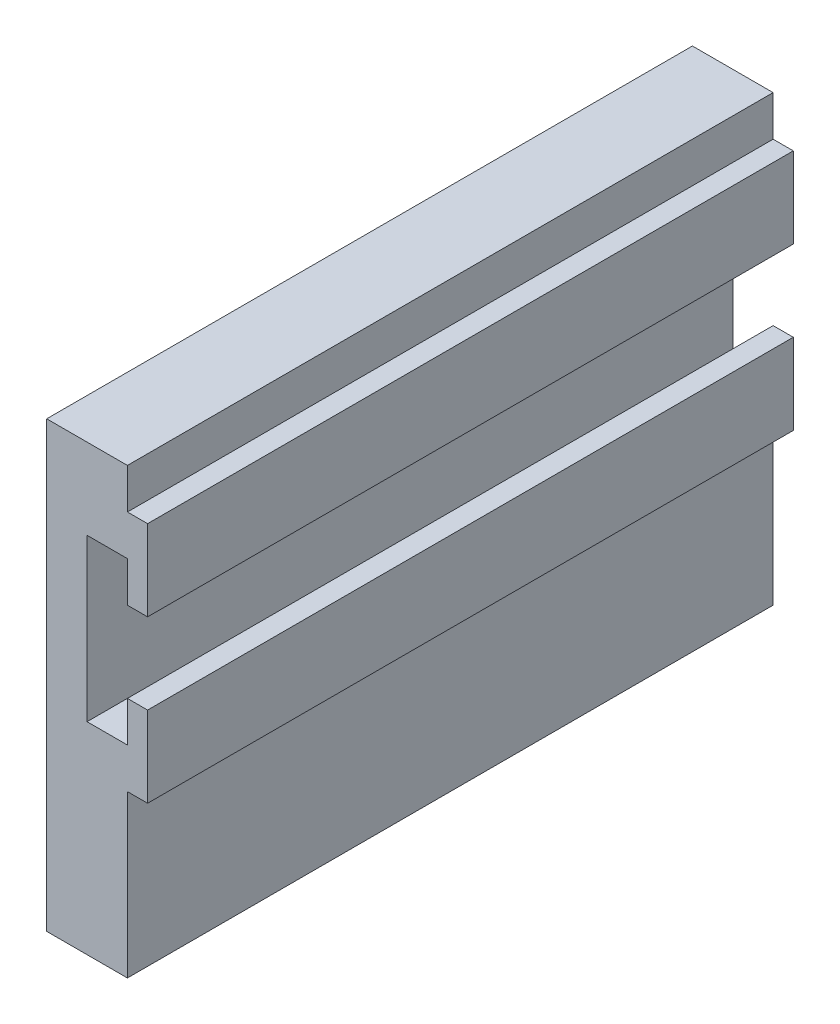
ISO-10303-21;
HEADER;
FILE_DESCRIPTION(('STEP AP214'),'2;1');
FILE_NAME('part.step','',(''),(''),'','','');
FILE_SCHEMA(('AUTOMOTIVE_DESIGN { 1 0 10303 214 1 1 1 1 }'));
ENDSEC;
DATA;
#1=APPLICATION_CONTEXT('core data for automotive mechanical design processes');
#2=APPLICATION_PROTOCOL_DEFINITION('international standard','automotive_design',2000,#1);
#3=PRODUCT_CONTEXT('',#1,'mechanical');
#4=PRODUCT('Part','Part','',(#3));
#5=PRODUCT_RELATED_PRODUCT_CATEGORY('part','',(#4));
#6=PRODUCT_DEFINITION_FORMATION('','',#4);
#7=PRODUCT_DEFINITION_CONTEXT('part definition',#1,'design');
#8=PRODUCT_DEFINITION('design','',#6,#7);
#9=PRODUCT_DEFINITION_SHAPE('','',#8);
#10=(LENGTH_UNIT() NAMED_UNIT(*) SI_UNIT(.MILLI.,.METRE.));
#11=(NAMED_UNIT(*) PLANE_ANGLE_UNIT() SI_UNIT($,.RADIAN.));
#12=(NAMED_UNIT(*) SI_UNIT($,.STERADIAN.) SOLID_ANGLE_UNIT());
#13=UNCERTAINTY_MEASURE_WITH_UNIT(LENGTH_MEASURE(1.E-05),#10,'distance_accuracy_value','');
#14=(GEOMETRIC_REPRESENTATION_CONTEXT(3) GLOBAL_UNCERTAINTY_ASSIGNED_CONTEXT((#13)) GLOBAL_UNIT_ASSIGNED_CONTEXT((#10,
#11,#12)) REPRESENTATION_CONTEXT('',''));
#15=CARTESIAN_POINT('',(0.,0.,0.));
#16=DIRECTION('',(0.,0.,1.));
#17=DIRECTION('',(1.,0.,0.));
#18=AXIS2_PLACEMENT_3D('',#15,#16,#17);
#19=CARTESIAN_POINT('',(0.,80.,160.));
#20=DIRECTION('',(1.,0.,0.));
#21=DIRECTION('',(0.,0.,-1.));
#22=AXIS2_PLACEMENT_3D('',#19,#20,#21);
#23=PLANE('',#22);
#24=DIRECTION('',(0.,-1.,0.));
#25=VECTOR('',#24,1.);
#26=CARTESIAN_POINT('',(0.,80.,0.));
#27=LINE('',#26,#25);
#28=CARTESIAN_POINT('',(0.,80.,0.));
#29=VERTEX_POINT('',#28);
#30=CARTESIAN_POINT('',(0.,-30.,0.));
#31=VERTEX_POINT('',#30);
#32=EDGE_CURVE('E235',#29,#31,#27,.T.);
#33=ORIENTED_EDGE('',*,*,#32,.T.);
#34=DIRECTION('',(0.,0.,-1.));
#35=VECTOR('',#34,1.);
#36=CARTESIAN_POINT('',(0.,-30.,160.));
#37=LINE('',#36,#35);
#38=CARTESIAN_POINT('',(0.,-30.,160.));
#39=VERTEX_POINT('',#38);
#40=EDGE_CURVE('E229',#39,#31,#37,.T.);
#41=ORIENTED_EDGE('',*,*,#40,.F.);
#42=DIRECTION('',(0.,-1.,0.));
#43=VECTOR('',#42,1.);
#44=CARTESIAN_POINT('',(0.,80.,160.));
#45=LINE('',#44,#43);
#46=CARTESIAN_POINT('',(0.,80.,160.));
#47=VERTEX_POINT('',#46);
#48=EDGE_CURVE('E236',#47,#39,#45,.T.);
#49=ORIENTED_EDGE('',*,*,#48,.F.);
#50=DIRECTION('',(0.,0.,-1.));
#51=VECTOR('',#50,1.);
#52=CARTESIAN_POINT('',(0.,80.,160.));
#53=LINE('',#52,#51);
#54=EDGE_CURVE('E250',#47,#29,#53,.T.);
#55=ORIENTED_EDGE('',*,*,#54,.T.);
#56=EDGE_LOOP('',(#33,#41,#49,#55));
#57=FACE_BOUND('',#56,.T.);
#58=ADVANCED_FACE('F34',(#57),#23,.F.);
#59=CARTESIAN_POINT('',(20.,0.,160.));
#60=DIRECTION('',(-1.,0.,0.));
#61=DIRECTION('',(0.,0.,1.));
#62=AXIS2_PLACEMENT_3D('',#59,#60,#61);
#63=PLANE('',#62);
#64=DIRECTION('',(0.,1.,0.));
#65=VECTOR('',#64,1.);
#66=CARTESIAN_POINT('',(20.,0.,0.));
#67=LINE('',#66,#65);
#68=CARTESIAN_POINT('',(20.,-30.,0.));
#69=VERTEX_POINT('',#68);
#70=CARTESIAN_POINT('',(20.,10.,0.));
#71=VERTEX_POINT('',#70);
#72=EDGE_CURVE('E252',#69,#71,#67,.T.);
#73=ORIENTED_EDGE('',*,*,#72,.T.);
#74=DIRECTION('',(0.,0.,1.));
#75=VECTOR('',#74,1.);
#76=CARTESIAN_POINT('',(20.,10.,160.));
#77=LINE('',#76,#75);
#78=CARTESIAN_POINT('',(20.,10.,160.));
#79=VERTEX_POINT('',#78);
#80=EDGE_CURVE('E56',#71,#79,#77,.T.);
#81=ORIENTED_EDGE('',*,*,#80,.T.);
#82=DIRECTION('',(0.,1.,0.));
#83=VECTOR('',#82,1.);
#84=CARTESIAN_POINT('',(20.,0.,160.));
#85=LINE('',#84,#83);
#86=CARTESIAN_POINT('',(20.,-30.,160.));
#87=VERTEX_POINT('',#86);
#88=EDGE_CURVE('E238',#87,#79,#85,.T.);
#89=ORIENTED_EDGE('',*,*,#88,.F.);
#90=DIRECTION('',(0.,0.,1.));
#91=VECTOR('',#90,1.);
#92=CARTESIAN_POINT('',(20.,-30.,160.));
#93=LINE('',#92,#91);
#94=EDGE_CURVE('E218',#69,#87,#93,.T.);
#95=ORIENTED_EDGE('',*,*,#94,.F.);
#96=EDGE_LOOP('',(#73,#81,#89,#95));
#97=FACE_BOUND('',#96,.T.);
#98=ADVANCED_FACE('F306',(#97),#63,.F.);
#99=CARTESIAN_POINT('',(20.,20.,160.));
#100=DIRECTION('',(0.,-1.,0.));
#101=DIRECTION('',(0.,0.,-1.));
#102=AXIS2_PLACEMENT_3D('',#99,#100,#101);
#103=PLANE('',#102);
#104=DIRECTION('',(-1.,0.,0.));
#105=VECTOR('',#104,1.);
#106=CARTESIAN_POINT('',(20.,20.,0.));
#107=LINE('',#106,#105);
#108=CARTESIAN_POINT('',(20.,20.,0.));
#109=VERTEX_POINT('',#108);
#110=CARTESIAN_POINT('',(10.,20.,0.));
#111=VERTEX_POINT('',#110);
#112=EDGE_CURVE('E254',#109,#111,#107,.T.);
#113=ORIENTED_EDGE('',*,*,#112,.T.);
#114=DIRECTION('',(0.,0.,-1.));
#115=VECTOR('',#114,1.);
#116=CARTESIAN_POINT('',(10.,20.,160.));
#117=LINE('',#116,#115);
#118=CARTESIAN_POINT('',(10.,20.,160.));
#119=VERTEX_POINT('',#118);
#120=EDGE_CURVE('E41',#119,#111,#117,.T.);
#121=ORIENTED_EDGE('',*,*,#120,.F.);
#122=DIRECTION('',(-1.,0.,0.));
#123=VECTOR('',#122,1.);
#124=CARTESIAN_POINT('',(20.,20.,160.));
#125=LINE('',#124,#123);
#126=CARTESIAN_POINT('',(20.,20.,160.));
#127=VERTEX_POINT('',#126);
#128=EDGE_CURVE('E241',#127,#119,#125,.T.);
#129=ORIENTED_EDGE('',*,*,#128,.F.);
#130=DIRECTION('',(0.,0.,-1.));
#131=VECTOR('',#130,1.);
#132=CARTESIAN_POINT('',(20.,20.,160.));
#133=LINE('',#132,#131);
#134=EDGE_CURVE('E11',#127,#109,#133,.T.);
#135=ORIENTED_EDGE('',*,*,#134,.T.);
#136=EDGE_LOOP('',(#113,#121,#129,#135));
#137=FACE_BOUND('',#136,.T.);
#138=ADVANCED_FACE('F287',(#137),#103,.F.);
#139=CARTESIAN_POINT('',(10.,20.,160.));
#140=DIRECTION('',(-1.,0.,0.));
#141=DIRECTION('',(0.,0.,1.));
#142=AXIS2_PLACEMENT_3D('',#139,#140,#141);
#143=PLANE('',#142);
#144=DIRECTION('',(0.,1.,0.));
#145=VECTOR('',#144,1.);
#146=CARTESIAN_POINT('',(10.,20.,0.));
#147=LINE('',#146,#145);
#148=CARTESIAN_POINT('',(10.,60.,0.));
#149=VERTEX_POINT('',#148);
#150=EDGE_CURVE('E256',#111,#149,#147,.T.);
#151=ORIENTED_EDGE('',*,*,#150,.T.);
#152=DIRECTION('',(0.,0.,-1.));
#153=VECTOR('',#152,1.);
#154=CARTESIAN_POINT('',(10.,60.,160.));
#155=LINE('',#154,#153);
#156=CARTESIAN_POINT('',(10.,60.,160.));
#157=VERTEX_POINT('',#156);
#158=EDGE_CURVE('E269',#157,#149,#155,.T.);
#159=ORIENTED_EDGE('',*,*,#158,.F.);
#160=DIRECTION('',(0.,1.,0.));
#161=VECTOR('',#160,1.);
#162=CARTESIAN_POINT('',(10.,20.,160.));
#163=LINE('',#162,#161);
#164=EDGE_CURVE('E243',#119,#157,#163,.T.);
#165=ORIENTED_EDGE('',*,*,#164,.F.);
#166=ORIENTED_EDGE('',*,*,#120,.T.);
#167=EDGE_LOOP('',(#151,#159,#165,#166));
#168=FACE_BOUND('',#167,.T.);
#169=ADVANCED_FACE('F276',(#168),#143,.F.);
#170=CARTESIAN_POINT('',(10.,60.,160.));
#171=DIRECTION('',(0.,1.,0.));
#172=DIRECTION('',(0.,0.,1.));
#173=AXIS2_PLACEMENT_3D('',#170,#171,#172);
#174=PLANE('',#173);
#175=DIRECTION('',(1.,0.,0.));
#176=VECTOR('',#175,1.);
#177=CARTESIAN_POINT('',(10.,60.,0.));
#178=LINE('',#177,#176);
#179=CARTESIAN_POINT('',(20.,60.,0.));
#180=VERTEX_POINT('',#179);
#181=EDGE_CURVE('E258',#149,#180,#178,.T.);
#182=ORIENTED_EDGE('',*,*,#181,.T.);
#183=DIRECTION('',(0.,0.,-1.));
#184=VECTOR('',#183,1.);
#185=CARTESIAN_POINT('',(20.,60.,160.));
#186=LINE('',#185,#184);
#187=CARTESIAN_POINT('',(20.,60.,160.));
#188=VERTEX_POINT('',#187);
#189=EDGE_CURVE('E155',#188,#180,#186,.T.);
#190=ORIENTED_EDGE('',*,*,#189,.F.);
#191=DIRECTION('',(1.,0.,0.));
#192=VECTOR('',#191,1.);
#193=CARTESIAN_POINT('',(10.,60.,160.));
#194=LINE('',#193,#192);
#195=EDGE_CURVE('E245',#157,#188,#194,.T.);
#196=ORIENTED_EDGE('',*,*,#195,.F.);
#197=ORIENTED_EDGE('',*,*,#158,.T.);
#198=EDGE_LOOP('',(#182,#190,#196,#197));
#199=FACE_BOUND('',#198,.T.);
#200=ADVANCED_FACE('F280',(#199),#174,.F.);
#201=CARTESIAN_POINT('',(20.,60.,160.));
#202=DIRECTION('',(-1.,0.,0.));
#203=DIRECTION('',(0.,0.,1.));
#204=AXIS2_PLACEMENT_3D('',#201,#202,#203);
#205=PLANE('',#204);
#206=DIRECTION('',(0.,1.,0.));
#207=VECTOR('',#206,1.);
#208=CARTESIAN_POINT('',(20.,60.,160.));
#209=LINE('',#208,#207);
#210=CARTESIAN_POINT('',(20.,70.,160.));
#211=VERTEX_POINT('',#210);
#212=CARTESIAN_POINT('',(20.,80.,160.));
#213=VERTEX_POINT('',#212);
#214=EDGE_CURVE('E48',#211,#213,#209,.T.);
#215=ORIENTED_EDGE('',*,*,#214,.F.);
#216=DIRECTION('',(0.,0.,-1.));
#217=VECTOR('',#216,1.);
#218=CARTESIAN_POINT('',(20.,70.,0.));
#219=LINE('',#218,#217);
#220=CARTESIAN_POINT('',(20.,70.,0.));
#221=VERTEX_POINT('',#220);
#222=EDGE_CURVE('E179',#211,#221,#219,.T.);
#223=ORIENTED_EDGE('',*,*,#222,.T.);
#224=DIRECTION('',(0.,1.,0.));
#225=VECTOR('',#224,1.);
#226=CARTESIAN_POINT('',(20.,60.,0.));
#227=LINE('',#226,#225);
#228=CARTESIAN_POINT('',(20.,80.,0.));
#229=VERTEX_POINT('',#228);
#230=EDGE_CURVE('E260',#221,#229,#227,.T.);
#231=ORIENTED_EDGE('',*,*,#230,.T.);
#232=DIRECTION('',(0.,0.,-1.));
#233=VECTOR('',#232,1.);
#234=CARTESIAN_POINT('',(20.,80.,160.));
#235=LINE('',#234,#233);
#236=EDGE_CURVE('E265',#213,#229,#235,.T.);
#237=ORIENTED_EDGE('',*,*,#236,.F.);
#238=EDGE_LOOP('',(#215,#223,#231,#237));
#239=FACE_BOUND('',#238,.T.);
#240=ADVANCED_FACE('F317',(#239),#205,.F.);
#241=CARTESIAN_POINT('',(20.,80.,160.));
#242=DIRECTION('',(0.,-1.,0.));
#243=DIRECTION('',(0.,0.,-1.));
#244=AXIS2_PLACEMENT_3D('',#241,#242,#243);
#245=PLANE('',#244);
#246=DIRECTION('',(-1.,0.,0.));
#247=VECTOR('',#246,1.);
#248=CARTESIAN_POINT('',(20.,80.,0.));
#249=LINE('',#248,#247);
#250=EDGE_CURVE('E239',#229,#29,#249,.T.);
#251=ORIENTED_EDGE('',*,*,#250,.T.);
#252=ORIENTED_EDGE('',*,*,#54,.F.);
#253=DIRECTION('',(-1.,0.,0.));
#254=VECTOR('',#253,1.);
#255=CARTESIAN_POINT('',(20.,80.,160.));
#256=LINE('',#255,#254);
#257=EDGE_CURVE('E248',#213,#47,#256,.T.);
#258=ORIENTED_EDGE('',*,*,#257,.F.);
#259=ORIENTED_EDGE('',*,*,#236,.T.);
#260=EDGE_LOOP('',(#251,#252,#258,#259));
#261=FACE_BOUND('',#260,.T.);
#262=ADVANCED_FACE('F316',(#261),#245,.F.);
#263=CARTESIAN_POINT('',(0.,0.,160.));
#264=DIRECTION('',(0.,0.,1.));
#265=DIRECTION('',(1.,0.,0.));
#266=AXIS2_PLACEMENT_3D('',#263,#264,#265);
#267=PLANE('',#266);
#268=ORIENTED_EDGE('',*,*,#48,.T.);
#269=DIRECTION('',(-1.,0.,0.));
#270=VECTOR('',#269,1.);
#271=CARTESIAN_POINT('',(20.,-30.,160.));
#272=LINE('',#271,#270);
#273=EDGE_CURVE('E226',#87,#39,#272,.T.);
#274=ORIENTED_EDGE('',*,*,#273,.F.);
#275=ORIENTED_EDGE('',*,*,#88,.T.);
#276=DIRECTION('',(1.,0.,0.));
#277=VECTOR('',#276,1.);
#278=CARTESIAN_POINT('',(20.,10.,160.));
#279=LINE('',#278,#277);
#280=CARTESIAN_POINT('',(25.,10.,160.));
#281=VERTEX_POINT('',#280);
#282=EDGE_CURVE('E206',#79,#281,#279,.T.);
#283=ORIENTED_EDGE('',*,*,#282,.T.);
#284=DIRECTION('',(0.,1.,0.));
#285=VECTOR('',#284,1.);
#286=CARTESIAN_POINT('',(25.,10.,160.));
#287=LINE('',#286,#285);
#288=CARTESIAN_POINT('',(25.,30.,160.));
#289=VERTEX_POINT('',#288);
#290=EDGE_CURVE('E221',#281,#289,#287,.T.);
#291=ORIENTED_EDGE('',*,*,#290,.T.);
#292=DIRECTION('',(1.,0.,0.));
#293=VECTOR('',#292,1.);
#294=CARTESIAN_POINT('',(20.,30.,160.));
#295=LINE('',#294,#293);
#296=CARTESIAN_POINT('',(20.,30.,160.));
#297=VERTEX_POINT('',#296);
#298=EDGE_CURVE('E196',#297,#289,#295,.T.);
#299=ORIENTED_EDGE('',*,*,#298,.F.);
#300=DIRECTION('',(0.,1.,0.));
#301=VECTOR('',#300,1.);
#302=CARTESIAN_POINT('',(20.,10.,160.));
#303=LINE('',#302,#301);
#304=EDGE_CURVE('E215',#127,#297,#303,.T.);
#305=ORIENTED_EDGE('',*,*,#304,.F.);
#306=ORIENTED_EDGE('',*,*,#128,.T.);
#307=ORIENTED_EDGE('',*,*,#164,.T.);
#308=ORIENTED_EDGE('',*,*,#195,.T.);
#309=DIRECTION('',(0.,-1.,0.));
#310=VECTOR('',#309,1.);
#311=CARTESIAN_POINT('',(20.,70.,160.));
#312=LINE('',#311,#310);
#313=CARTESIAN_POINT('',(20.,50.,160.));
#314=VERTEX_POINT('',#313);
#315=EDGE_CURVE('E188',#188,#314,#312,.T.);
#316=ORIENTED_EDGE('',*,*,#315,.T.);
#317=DIRECTION('',(-1.,0.,0.));
#318=VECTOR('',#317,1.);
#319=CARTESIAN_POINT('',(20.,50.,160.));
#320=LINE('',#319,#318);
#321=CARTESIAN_POINT('',(25.,50.,160.));
#322=VERTEX_POINT('',#321);
#323=EDGE_CURVE('E174',#322,#314,#320,.T.);
#324=ORIENTED_EDGE('',*,*,#323,.F.);
#325=DIRECTION('',(0.,-1.,0.));
#326=VECTOR('',#325,1.);
#327=CARTESIAN_POINT('',(25.,70.,160.));
#328=LINE('',#327,#326);
#329=CARTESIAN_POINT('',(25.,70.,160.));
#330=VERTEX_POINT('',#329);
#331=EDGE_CURVE('E191',#330,#322,#328,.T.);
#332=ORIENTED_EDGE('',*,*,#331,.F.);
#333=DIRECTION('',(-1.,0.,0.));
#334=VECTOR('',#333,1.);
#335=CARTESIAN_POINT('',(20.,70.,160.));
#336=LINE('',#335,#334);
#337=EDGE_CURVE('E159',#330,#211,#336,.T.);
#338=ORIENTED_EDGE('',*,*,#337,.T.);
#339=ORIENTED_EDGE('',*,*,#214,.T.);
#340=ORIENTED_EDGE('',*,*,#257,.T.);
#341=EDGE_LOOP('',(#268,#274,#275,#283,#291,#299,#305,#306,#307,#308,#316,#324,#332,#338,#339,#340));
#342=FACE_BOUND('',#341,.T.);
#343=ADVANCED_FACE('F283',(#342),#267,.T.);
#344=CARTESIAN_POINT('',(0.,0.,0.));
#345=DIRECTION('',(0.,0.,1.));
#346=DIRECTION('',(1.,0.,0.));
#347=AXIS2_PLACEMENT_3D('',#344,#345,#346);
#348=PLANE('',#347);
#349=ORIENTED_EDGE('',*,*,#32,.F.);
#350=ORIENTED_EDGE('',*,*,#250,.F.);
#351=ORIENTED_EDGE('',*,*,#230,.F.);
#352=DIRECTION('',(1.,0.,0.));
#353=VECTOR('',#352,1.);
#354=CARTESIAN_POINT('',(20.,70.,0.));
#355=LINE('',#354,#353);
#356=CARTESIAN_POINT('',(25.,70.,0.));
#357=VERTEX_POINT('',#356);
#358=EDGE_CURVE('E181',#221,#357,#355,.T.);
#359=ORIENTED_EDGE('',*,*,#358,.T.);
#360=DIRECTION('',(0.,-1.,0.));
#361=VECTOR('',#360,1.);
#362=CARTESIAN_POINT('',(25.,70.,0.));
#363=LINE('',#362,#361);
#364=CARTESIAN_POINT('',(25.,50.,0.));
#365=VERTEX_POINT('',#364);
#366=EDGE_CURVE('E158',#357,#365,#363,.T.);
#367=ORIENTED_EDGE('',*,*,#366,.T.);
#368=DIRECTION('',(1.,0.,0.));
#369=VECTOR('',#368,1.);
#370=CARTESIAN_POINT('',(20.,50.,0.));
#371=LINE('',#370,#369);
#372=CARTESIAN_POINT('',(20.,50.,0.));
#373=VERTEX_POINT('',#372);
#374=EDGE_CURVE('E162',#373,#365,#371,.T.);
#375=ORIENTED_EDGE('',*,*,#374,.F.);
#376=DIRECTION('',(0.,-1.,0.));
#377=VECTOR('',#376,1.);
#378=CARTESIAN_POINT('',(20.,70.,0.));
#379=LINE('',#378,#377);
#380=EDGE_CURVE('E148',#180,#373,#379,.T.);
#381=ORIENTED_EDGE('',*,*,#380,.F.);
#382=ORIENTED_EDGE('',*,*,#181,.F.);
#383=ORIENTED_EDGE('',*,*,#150,.F.);
#384=ORIENTED_EDGE('',*,*,#112,.F.);
#385=DIRECTION('',(0.,1.,0.));
#386=VECTOR('',#385,1.);
#387=CARTESIAN_POINT('',(20.,10.,0.));
#388=LINE('',#387,#386);
#389=CARTESIAN_POINT('',(20.,30.,0.));
#390=VERTEX_POINT('',#389);
#391=EDGE_CURVE('E216',#109,#390,#388,.T.);
#392=ORIENTED_EDGE('',*,*,#391,.T.);
#393=DIRECTION('',(-1.,0.,0.));
#394=VECTOR('',#393,1.);
#395=CARTESIAN_POINT('',(20.,30.,0.));
#396=LINE('',#395,#394);
#397=CARTESIAN_POINT('',(25.,30.,0.));
#398=VERTEX_POINT('',#397);
#399=EDGE_CURVE('E202',#398,#390,#396,.T.);
#400=ORIENTED_EDGE('',*,*,#399,.F.);
#401=DIRECTION('',(0.,1.,0.));
#402=VECTOR('',#401,1.);
#403=CARTESIAN_POINT('',(25.,10.,0.));
#404=LINE('',#403,#402);
#405=CARTESIAN_POINT('',(25.,10.,0.));
#406=VERTEX_POINT('',#405);
#407=EDGE_CURVE('E219',#406,#398,#404,.T.);
#408=ORIENTED_EDGE('',*,*,#407,.F.);
#409=DIRECTION('',(-1.,0.,0.));
#410=VECTOR('',#409,1.);
#411=CARTESIAN_POINT('',(20.,10.,0.));
#412=LINE('',#411,#410);
#413=EDGE_CURVE('E212',#406,#71,#412,.T.);
#414=ORIENTED_EDGE('',*,*,#413,.T.);
#415=ORIENTED_EDGE('',*,*,#72,.F.);
#416=DIRECTION('',(1.,0.,0.));
#417=VECTOR('',#416,1.);
#418=CARTESIAN_POINT('',(20.,-30.,0.));
#419=LINE('',#418,#417);
#420=EDGE_CURVE('E232',#31,#69,#419,.T.);
#421=ORIENTED_EDGE('',*,*,#420,.F.);
#422=EDGE_LOOP('',(#349,#350,#351,#359,#367,#375,#381,#382,#383,#384,#392,#400,#408,#414,#415,#421));
#423=FACE_BOUND('',#422,.T.);
#424=ADVANCED_FACE('F164',(#423),#348,.F.);
#425=CARTESIAN_POINT('',(0.,-30.,0.));
#426=DIRECTION('',(0.,1.,0.));
#427=DIRECTION('',(0.,0.,1.));
#428=AXIS2_PLACEMENT_3D('',#425,#426,#427);
#429=PLANE('',#428);
#430=ORIENTED_EDGE('',*,*,#94,.T.);
#431=ORIENTED_EDGE('',*,*,#273,.T.);
#432=ORIENTED_EDGE('',*,*,#40,.T.);
#433=ORIENTED_EDGE('',*,*,#420,.T.);
#434=EDGE_LOOP('',(#430,#431,#432,#433));
#435=FACE_BOUND('',#434,.T.);
#436=ADVANCED_FACE('F308',(#435),#429,.F.);
#437=CARTESIAN_POINT('',(20.,10.,160.));
#438=DIRECTION('',(-1.,0.,0.));
#439=DIRECTION('',(0.,0.,1.));
#440=AXIS2_PLACEMENT_3D('',#437,#438,#439);
#441=PLANE('',#440);
#442=ORIENTED_EDGE('',*,*,#134,.F.);
#443=ORIENTED_EDGE('',*,*,#304,.T.);
#444=DIRECTION('',(0.,0.,1.));
#445=VECTOR('',#444,1.);
#446=CARTESIAN_POINT('',(20.,30.,160.));
#447=LINE('',#446,#445);
#448=EDGE_CURVE('E190',#390,#297,#447,.T.);
#449=ORIENTED_EDGE('',*,*,#448,.F.);
#450=ORIENTED_EDGE('',*,*,#391,.F.);
#451=EDGE_LOOP('',(#442,#443,#449,#450));
#452=FACE_BOUND('',#451,.T.);
#453=ADVANCED_FACE('F290',(#452),#441,.T.);
#454=CARTESIAN_POINT('',(25.,10.,160.));
#455=DIRECTION('',(1.,0.,0.));
#456=DIRECTION('',(0.,0.,-1.));
#457=AXIS2_PLACEMENT_3D('',#454,#455,#456);
#458=PLANE('',#457);
#459=ORIENTED_EDGE('',*,*,#407,.T.);
#460=DIRECTION('',(0.,0.,-1.));
#461=VECTOR('',#460,1.);
#462=CARTESIAN_POINT('',(25.,30.,160.));
#463=LINE('',#462,#461);
#464=EDGE_CURVE('E199',#289,#398,#463,.T.);
#465=ORIENTED_EDGE('',*,*,#464,.F.);
#466=ORIENTED_EDGE('',*,*,#290,.F.);
#467=DIRECTION('',(0.,0.,-1.));
#468=VECTOR('',#467,1.);
#469=CARTESIAN_POINT('',(25.,10.,160.));
#470=LINE('',#469,#468);
#471=EDGE_CURVE('E209',#281,#406,#470,.T.);
#472=ORIENTED_EDGE('',*,*,#471,.T.);
#473=EDGE_LOOP('',(#459,#465,#466,#472));
#474=FACE_BOUND('',#473,.T.);
#475=ADVANCED_FACE('F297',(#474),#458,.T.);
#476=CARTESIAN_POINT('',(0.,10.,0.));
#477=DIRECTION('',(0.,-1.,0.));
#478=DIRECTION('',(0.,0.,-1.));
#479=AXIS2_PLACEMENT_3D('',#476,#477,#478);
#480=PLANE('',#479);
#481=ORIENTED_EDGE('',*,*,#80,.F.);
#482=ORIENTED_EDGE('',*,*,#413,.F.);
#483=ORIENTED_EDGE('',*,*,#471,.F.);
#484=ORIENTED_EDGE('',*,*,#282,.F.);
#485=EDGE_LOOP('',(#481,#482,#483,#484));
#486=FACE_BOUND('',#485,.T.);
#487=ADVANCED_FACE('F302',(#486),#480,.T.);
#488=CARTESIAN_POINT('',(0.,30.,0.));
#489=DIRECTION('',(0.,-1.,0.));
#490=DIRECTION('',(0.,0.,-1.));
#491=AXIS2_PLACEMENT_3D('',#488,#489,#490);
#492=PLANE('',#491);
#493=ORIENTED_EDGE('',*,*,#448,.T.);
#494=ORIENTED_EDGE('',*,*,#298,.T.);
#495=ORIENTED_EDGE('',*,*,#464,.T.);
#496=ORIENTED_EDGE('',*,*,#399,.T.);
#497=EDGE_LOOP('',(#493,#494,#495,#496));
#498=FACE_BOUND('',#497,.T.);
#499=ADVANCED_FACE('F294',(#498),#492,.F.);
#500=CARTESIAN_POINT('',(20.,70.,0.));
#501=DIRECTION('',(-1.,0.,0.));
#502=DIRECTION('',(0.,0.,1.));
#503=AXIS2_PLACEMENT_3D('',#500,#501,#502);
#504=PLANE('',#503);
#505=ORIENTED_EDGE('',*,*,#189,.T.);
#506=ORIENTED_EDGE('',*,*,#380,.T.);
#507=DIRECTION('',(0.,0.,-1.));
#508=VECTOR('',#507,1.);
#509=CARTESIAN_POINT('',(20.,50.,0.));
#510=LINE('',#509,#508);
#511=EDGE_CURVE('E153',#314,#373,#510,.T.);
#512=ORIENTED_EDGE('',*,*,#511,.F.);
#513=ORIENTED_EDGE('',*,*,#315,.F.);
#514=EDGE_LOOP('',(#505,#506,#512,#513));
#515=FACE_BOUND('',#514,.T.);
#516=ADVANCED_FACE('F150',(#515),#504,.T.);
#517=CARTESIAN_POINT('',(25.,70.,0.));
#518=DIRECTION('',(1.,0.,0.));
#519=DIRECTION('',(0.,0.,-1.));
#520=AXIS2_PLACEMENT_3D('',#517,#518,#519);
#521=PLANE('',#520);
#522=ORIENTED_EDGE('',*,*,#331,.T.);
#523=DIRECTION('',(0.,0.,1.));
#524=VECTOR('',#523,1.);
#525=CARTESIAN_POINT('',(25.,50.,0.));
#526=LINE('',#525,#524);
#527=EDGE_CURVE('E169',#365,#322,#526,.T.);
#528=ORIENTED_EDGE('',*,*,#527,.F.);
#529=ORIENTED_EDGE('',*,*,#366,.F.);
#530=DIRECTION('',(0.,0.,1.));
#531=VECTOR('',#530,1.);
#532=CARTESIAN_POINT('',(25.,70.,0.));
#533=LINE('',#532,#531);
#534=EDGE_CURVE('E183',#357,#330,#533,.T.);
#535=ORIENTED_EDGE('',*,*,#534,.T.);
#536=EDGE_LOOP('',(#522,#528,#529,#535));
#537=FACE_BOUND('',#536,.T.);
#538=ADVANCED_FACE('F324',(#537),#521,.T.);
#539=CARTESIAN_POINT('',(0.,70.,0.));
#540=DIRECTION('',(0.,1.,0.));
#541=DIRECTION('',(0.,0.,1.));
#542=AXIS2_PLACEMENT_3D('',#539,#540,#541);
#543=PLANE('',#542);
#544=ORIENTED_EDGE('',*,*,#222,.F.);
#545=ORIENTED_EDGE('',*,*,#337,.F.);
#546=ORIENTED_EDGE('',*,*,#534,.F.);
#547=ORIENTED_EDGE('',*,*,#358,.F.);
#548=EDGE_LOOP('',(#544,#545,#546,#547));
#549=FACE_BOUND('',#548,.T.);
#550=ADVANCED_FACE('F321',(#549),#543,.T.);
#551=CARTESIAN_POINT('',(0.,50.,0.));
#552=DIRECTION('',(0.,1.,0.));
#553=DIRECTION('',(0.,0.,1.));
#554=AXIS2_PLACEMENT_3D('',#551,#552,#553);
#555=PLANE('',#554);
#556=ORIENTED_EDGE('',*,*,#511,.T.);
#557=ORIENTED_EDGE('',*,*,#374,.T.);
#558=ORIENTED_EDGE('',*,*,#527,.T.);
#559=ORIENTED_EDGE('',*,*,#323,.T.);
#560=EDGE_LOOP('',(#556,#557,#558,#559));
#561=FACE_BOUND('',#560,.T.);
#562=ADVANCED_FACE('F172',(#561),#555,.F.);
#563=CLOSED_SHELL('',(#58,#98,#138,#169,#200,#240,#262,#343,#424,#436,#453,#475,#487,#499,#516,
#538,#550,#562));
#564=MANIFOLD_SOLID_BREP('B2',#563);
#565=ADVANCED_BREP_SHAPE_REPRESENTATION('',(#18,#564),#14);
#566=SHAPE_DEFINITION_REPRESENTATION(#9,#565);
ENDSEC;
END-ISO-10303-21;
